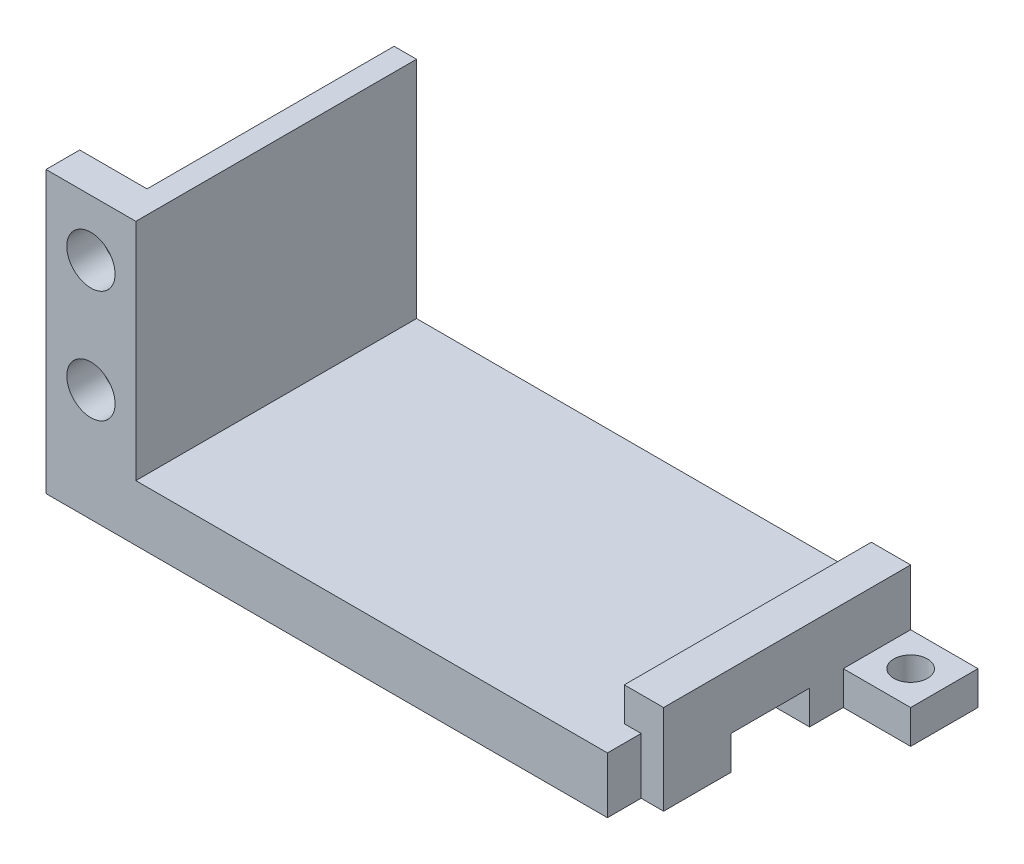
ISO-10303-21;
HEADER;
FILE_DESCRIPTION(('STEP AP214'),'2;1');
FILE_NAME('part.step','',(''),(''),'','','');
FILE_SCHEMA(('AUTOMOTIVE_DESIGN { 1 0 10303 214 1 1 1 1 }'));
ENDSEC;
DATA;
#1=APPLICATION_CONTEXT('core data for automotive mechanical design processes');
#2=APPLICATION_PROTOCOL_DEFINITION('international standard','automotive_design',2000,#1);
#3=PRODUCT_CONTEXT('',#1,'mechanical');
#4=PRODUCT('Part','Part','',(#3));
#5=PRODUCT_RELATED_PRODUCT_CATEGORY('part','',(#4));
#6=PRODUCT_DEFINITION_FORMATION('','',#4);
#7=PRODUCT_DEFINITION_CONTEXT('part definition',#1,'design');
#8=PRODUCT_DEFINITION('design','',#6,#7);
#9=PRODUCT_DEFINITION_SHAPE('','',#8);
#10=(LENGTH_UNIT() NAMED_UNIT(*) SI_UNIT(.MILLI.,.METRE.));
#11=(NAMED_UNIT(*) PLANE_ANGLE_UNIT() SI_UNIT($,.RADIAN.));
#12=(NAMED_UNIT(*) SI_UNIT($,.STERADIAN.) SOLID_ANGLE_UNIT());
#13=UNCERTAINTY_MEASURE_WITH_UNIT(LENGTH_MEASURE(1.E-05),#10,'distance_accuracy_value','');
#14=(GEOMETRIC_REPRESENTATION_CONTEXT(3) GLOBAL_UNCERTAINTY_ASSIGNED_CONTEXT((#13)) GLOBAL_UNIT_ASSIGNED_CONTEXT((#10,
#11,#12)) REPRESENTATION_CONTEXT('',''));
#15=CARTESIAN_POINT('',(0.,0.,0.));
#16=DIRECTION('',(0.,0.,1.));
#17=DIRECTION('',(1.,0.,0.));
#18=AXIS2_PLACEMENT_3D('',#15,#16,#17);
#19=CARTESIAN_POINT('',(0.,-15.,0.));
#20=DIRECTION('',(0.,-1.,0.));
#21=DIRECTION('',(0.,0.,-1.));
#22=AXIS2_PLACEMENT_3D('',#19,#20,#21);
#23=PLANE('',#22);
#24=DIRECTION('',(1.,0.,0.));
#25=VECTOR('',#24,1.);
#26=CARTESIAN_POINT('',(0.,-15.,-13.));
#27=LINE('',#26,#25);
#28=CARTESIAN_POINT('',(1.3,-15.,-13.));
#29=VERTEX_POINT('',#28);
#30=CARTESIAN_POINT('',(47.3,-15.,-13.));
#31=VERTEX_POINT('',#30);
#32=EDGE_CURVE('E11',#29,#31,#27,.T.);
#33=ORIENTED_EDGE('',*,*,#32,.F.);
#34=DIRECTION('',(0.,0.,-1.));
#35=VECTOR('',#34,1.);
#36=CARTESIAN_POINT('',(1.3,-15.,-22.));
#37=LINE('',#36,#35);
#38=CARTESIAN_POINT('',(1.3,-15.,-16.));
#39=VERTEX_POINT('',#38);
#40=EDGE_CURVE('E226',#29,#39,#37,.T.);
#41=ORIENTED_EDGE('',*,*,#40,.T.);
#42=DIRECTION('',(1.,0.,0.));
#43=VECTOR('',#42,1.);
#44=CARTESIAN_POINT('',(-4.7,-15.,-16.));
#45=LINE('',#44,#43);
#46=CARTESIAN_POINT('',(-4.7,-15.,-16.));
#47=VERTEX_POINT('',#46);
#48=EDGE_CURVE('E396',#47,#39,#45,.T.);
#49=ORIENTED_EDGE('',*,*,#48,.F.);
#50=DIRECTION('',(0.,0.,1.));
#51=VECTOR('',#50,1.);
#52=CARTESIAN_POINT('',(-4.7,-15.,-22.));
#53=LINE('',#52,#51);
#54=CARTESIAN_POINT('',(-4.7,-15.,-22.));
#55=VERTEX_POINT('',#54);
#56=EDGE_CURVE('E381',#55,#47,#53,.T.);
#57=ORIENTED_EDGE('',*,*,#56,.F.);
#58=DIRECTION('',(1.,0.,0.));
#59=VECTOR('',#58,1.);
#60=CARTESIAN_POINT('',(1.3,-15.,-22.));
#61=LINE('',#60,#59);
#62=CARTESIAN_POINT('',(53.3,-15.,-22.));
#63=VERTEX_POINT('',#62);
#64=EDGE_CURVE('E239',#55,#63,#61,.T.);
#65=ORIENTED_EDGE('',*,*,#64,.T.);
#66=DIRECTION('',(0.,0.,-1.));
#67=VECTOR('',#66,1.);
#68=CARTESIAN_POINT('',(53.3,-15.,-22.));
#69=LINE('',#68,#67);
#70=CARTESIAN_POINT('',(53.3,-15.,-16.));
#71=VERTEX_POINT('',#70);
#72=EDGE_CURVE('E358',#71,#63,#69,.T.);
#73=ORIENTED_EDGE('',*,*,#72,.F.);
#74=DIRECTION('',(-1.,0.,0.));
#75=VECTOR('',#74,1.);
#76=CARTESIAN_POINT('',(53.3,-15.,-16.));
#77=LINE('',#76,#75);
#78=CARTESIAN_POINT('',(47.3,-15.,-16.));
#79=VERTEX_POINT('',#78);
#80=EDGE_CURVE('E361',#71,#79,#77,.T.);
#81=ORIENTED_EDGE('',*,*,#80,.T.);
#82=DIRECTION('',(0.,0.,1.));
#83=VECTOR('',#82,1.);
#84=CARTESIAN_POINT('',(47.3,-15.,0.));
#85=LINE('',#84,#83);
#86=EDGE_CURVE('E230',#79,#31,#85,.T.);
#87=ORIENTED_EDGE('',*,*,#86,.T.);
#88=EDGE_LOOP('',(#33,#41,#49,#57,#65,#73,#81,#87));
#89=FACE_BOUND('',#88,.T.);
#90=CARTESIAN_POINT('',(50.3,-15.,-19.));
#91=DIRECTION('',(0.,-1.,0.));
#92=DIRECTION('',(0.,0.,-1.));
#93=AXIS2_PLACEMENT_3D('',#90,#91,#92);
#94=CIRCLE('',#93,1.5);
#95=CARTESIAN_POINT('',(50.3,-15.,-20.5));
#96=VERTEX_POINT('',#95);
#97=EDGE_CURVE('E346',#96,#96,#94,.T.);
#98=ORIENTED_EDGE('',*,*,#97,.F.);
#99=EDGE_LOOP('',(#98));
#100=FACE_BOUND('',#99,.T.);
#101=CARTESIAN_POINT('',(-1.7,-15.,-19.));
#102=DIRECTION('',(0.,-1.,0.));
#103=DIRECTION('',(0.,0.,-1.));
#104=AXIS2_PLACEMENT_3D('',#101,#102,#103);
#105=CIRCLE('',#104,1.5);
#106=CARTESIAN_POINT('',(-1.7,-15.,-20.5));
#107=VERTEX_POINT('',#106);
#108=EDGE_CURVE('E375',#107,#107,#105,.T.);
#109=ORIENTED_EDGE('',*,*,#108,.F.);
#110=EDGE_LOOP('',(#109));
#111=FACE_BOUND('',#110,.T.);
#112=ADVANCED_FACE('F38',(#89,#100,#111),#23,.T.);
#113=CARTESIAN_POINT('',(1.3,10.,-22.));
#114=DIRECTION('',(1.,0.,0.));
#115=DIRECTION('',(0.,0.,-1.));
#116=AXIS2_PLACEMENT_3D('',#113,#114,#115);
#117=PLANE('',#116);
#118=DIRECTION('',(0.,1.,0.));
#119=VECTOR('',#118,1.);
#120=CARTESIAN_POINT('',(1.3,10.,-22.));
#121=LINE('',#120,#119);
#122=CARTESIAN_POINT('',(1.3,-4.21101330809702,-22.));
#123=VERTEX_POINT('',#122);
#124=CARTESIAN_POINT('',(1.3,4.21101330809702,-22.));
#125=VERTEX_POINT('',#124);
#126=EDGE_CURVE('E263',#123,#125,#121,.T.);
#127=ORIENTED_EDGE('',*,*,#126,.F.);
#128=DIRECTION('',(0.,0.,1.));
#129=VECTOR('',#128,1.);
#130=CARTESIAN_POINT('',(1.3,-4.21101330809702,-36.962340393569));
#131=LINE('',#130,#129);
#132=CARTESIAN_POINT('',(1.3,-4.21101330809702,0.));
#133=VERTEX_POINT('',#132);
#134=EDGE_CURVE('E338',#123,#133,#131,.T.);
#135=ORIENTED_EDGE('',*,*,#134,.T.);
#136=DIRECTION('',(0.,1.,0.));
#137=VECTOR('',#136,1.);
#138=CARTESIAN_POINT('',(1.3,10.,0.));
#139=LINE('',#138,#137);
#140=CARTESIAN_POINT('',(1.3,4.21101330809702,0.));
#141=VERTEX_POINT('',#140);
#142=EDGE_CURVE('E271',#133,#141,#139,.T.);
#143=ORIENTED_EDGE('',*,*,#142,.T.);
#144=DIRECTION('',(0.,0.,1.));
#145=VECTOR('',#144,1.);
#146=CARTESIAN_POINT('',(1.3,4.21101330809702,-36.962340393569));
#147=LINE('',#146,#145);
#148=EDGE_CURVE('E326',#141,#125,#147,.F.);
#149=ORIENTED_EDGE('',*,*,#148,.T.);
#150=EDGE_LOOP('',(#127,#135,#143,#149));
#151=FACE_BOUND('',#150,.T.);
#152=ADVANCED_FACE('F488',(#151),#117,.F.);
#153=CARTESIAN_POINT('',(1.3,5.78898669190298,-22.));
#154=VERTEX_POINT('',#153);
#155=CARTESIAN_POINT('',(1.3,10.,-22.));
#156=VERTEX_POINT('',#155);
#157=EDGE_CURVE('E258',#154,#156,#121,.T.);
#158=ORIENTED_EDGE('',*,*,#157,.F.);
#159=DIRECTION('',(0.,0.,1.));
#160=VECTOR('',#159,1.);
#161=CARTESIAN_POINT('',(1.3,5.78898669190298,-36.962340393569));
#162=LINE('',#161,#160);
#163=CARTESIAN_POINT('',(1.3,5.78898669190298,0.));
#164=VERTEX_POINT('',#163);
#165=EDGE_CURVE('E61',#154,#164,#162,.T.);
#166=ORIENTED_EDGE('',*,*,#165,.T.);
#167=CARTESIAN_POINT('',(1.3,10.,0.));
#168=VERTEX_POINT('',#167);
#169=EDGE_CURVE('E272',#164,#168,#139,.T.);
#170=ORIENTED_EDGE('',*,*,#169,.T.);
#171=DIRECTION('',(0.,0.,1.));
#172=VECTOR('',#171,1.);
#173=CARTESIAN_POINT('',(1.3,10.,-22.));
#174=LINE('',#173,#172);
#175=EDGE_CURVE('E266',#156,#168,#174,.T.);
#176=ORIENTED_EDGE('',*,*,#175,.F.);
#177=EDGE_LOOP('',(#158,#166,#170,#176));
#178=FACE_BOUND('',#177,.T.);
#179=ADVANCED_FACE('F523',(#178),#117,.F.);
#180=CARTESIAN_POINT('',(47.3,-15.,0.));
#181=DIRECTION('',(-1.,0.,0.));
#182=DIRECTION('',(0.,0.,1.));
#183=AXIS2_PLACEMENT_3D('',#180,#181,#182);
#184=PLANE('',#183);
#185=DIRECTION('',(0.,0.,-1.));
#186=VECTOR('',#185,1.);
#187=CARTESIAN_POINT('',(47.3,-12.,0.));
#188=LINE('',#187,#186);
#189=CARTESIAN_POINT('',(47.3,-12.,-6.));
#190=VERTEX_POINT('',#189);
#191=CARTESIAN_POINT('',(47.3,-12.,-13.));
#192=VERTEX_POINT('',#191);
#193=EDGE_CURVE('E451',#190,#192,#188,.T.);
#194=ORIENTED_EDGE('',*,*,#193,.T.);
#195=DIRECTION('',(0.,-1.,0.));
#196=VECTOR('',#195,1.);
#197=CARTESIAN_POINT('',(47.3,-15.,-13.));
#198=LINE('',#197,#196);
#199=EDGE_CURVE('E454',#192,#31,#198,.T.);
#200=ORIENTED_EDGE('',*,*,#199,.T.);
#201=ORIENTED_EDGE('',*,*,#86,.F.);
#202=DIRECTION('',(0.,-1.,0.));
#203=VECTOR('',#202,1.);
#204=CARTESIAN_POINT('',(47.3,-15.,-16.));
#205=LINE('',#204,#203);
#206=CARTESIAN_POINT('',(47.3,-12.,-16.));
#207=VERTEX_POINT('',#206);
#208=EDGE_CURVE('E354',#207,#79,#205,.T.);
#209=ORIENTED_EDGE('',*,*,#208,.F.);
#210=DIRECTION('',(0.,0.,1.));
#211=VECTOR('',#210,1.);
#212=CARTESIAN_POINT('',(47.3,-12.,-22.));
#213=LINE('',#212,#211);
#214=CARTESIAN_POINT('',(47.3,-12.,-22.));
#215=VERTEX_POINT('',#214);
#216=EDGE_CURVE('E349',#215,#207,#213,.T.);
#217=ORIENTED_EDGE('',*,*,#216,.F.);
#218=DIRECTION('',(0.,1.,0.));
#219=VECTOR('',#218,1.);
#220=CARTESIAN_POINT('',(47.3,-15.,-22.));
#221=LINE('',#220,#219);
#222=CARTESIAN_POINT('',(47.3,-7.,-22.));
#223=VERTEX_POINT('',#222);
#224=EDGE_CURVE('E410',#215,#223,#221,.T.);
#225=ORIENTED_EDGE('',*,*,#224,.T.);
#226=DIRECTION('',(0.,0.,-1.));
#227=VECTOR('',#226,1.);
#228=CARTESIAN_POINT('',(47.3,-7.,-22.));
#229=LINE('',#228,#227);
#230=CARTESIAN_POINT('',(47.3,-7.,0.));
#231=VERTEX_POINT('',#230);
#232=EDGE_CURVE('E401',#231,#223,#229,.T.);
#233=ORIENTED_EDGE('',*,*,#232,.F.);
#234=DIRECTION('',(0.,1.,0.));
#235=VECTOR('',#234,1.);
#236=CARTESIAN_POINT('',(47.3,-15.,0.));
#237=LINE('',#236,#235);
#238=CARTESIAN_POINT('',(47.3,-15.,0.));
#239=VERTEX_POINT('',#238);
#240=EDGE_CURVE('E414',#239,#231,#237,.T.);
#241=ORIENTED_EDGE('',*,*,#240,.F.);
#242=CARTESIAN_POINT('',(47.3,-15.,-6.));
#243=VERTEX_POINT('',#242);
#244=EDGE_CURVE('E406',#243,#239,#85,.T.);
#245=ORIENTED_EDGE('',*,*,#244,.F.);
#246=DIRECTION('',(0.,1.,0.));
#247=VECTOR('',#246,1.);
#248=CARTESIAN_POINT('',(47.3,-15.,-6.));
#249=LINE('',#248,#247);
#250=EDGE_CURVE('E53',#243,#190,#249,.T.);
#251=ORIENTED_EDGE('',*,*,#250,.T.);
#252=EDGE_LOOP('',(#194,#200,#201,#209,#217,#225,#233,#241,#245,#251));
#253=FACE_BOUND('',#252,.T.);
#254=ADVANCED_FACE('F463',(#253),#184,.F.);
#255=ORIENTED_EDGE('',*,*,#40,.F.);
#256=DIRECTION('',(0.,-1.,0.));
#257=VECTOR('',#256,1.);
#258=CARTESIAN_POINT('',(1.3,-15.,-13.));
#259=LINE('',#258,#257);
#260=CARTESIAN_POINT('',(1.3,-12.,-13.));
#261=VERTEX_POINT('',#260);
#262=EDGE_CURVE('E210',#261,#29,#259,.T.);
#263=ORIENTED_EDGE('',*,*,#262,.F.);
#264=DIRECTION('',(0.,0.,-1.));
#265=VECTOR('',#264,1.);
#266=CARTESIAN_POINT('',(1.3,-12.,-13.));
#267=LINE('',#266,#265);
#268=CARTESIAN_POINT('',(1.3,-12.,-6.));
#269=VERTEX_POINT('',#268);
#270=EDGE_CURVE('E295',#269,#261,#267,.T.);
#271=ORIENTED_EDGE('',*,*,#270,.F.);
#272=DIRECTION('',(0.,1.,0.));
#273=VECTOR('',#272,1.);
#274=CARTESIAN_POINT('',(1.3,-15.,-6.));
#275=LINE('',#274,#273);
#276=CARTESIAN_POINT('',(1.3,-15.,-6.));
#277=VERTEX_POINT('',#276);
#278=EDGE_CURVE('E220',#277,#269,#275,.T.);
#279=ORIENTED_EDGE('',*,*,#278,.F.);
#280=CARTESIAN_POINT('',(1.3,-15.,0.));
#281=VERTEX_POINT('',#280);
#282=EDGE_CURVE('E235',#281,#277,#37,.T.);
#283=ORIENTED_EDGE('',*,*,#282,.F.);
#284=CARTESIAN_POINT('',(1.3,-5.78898669190298,0.));
#285=VERTEX_POINT('',#284);
#286=EDGE_CURVE('E267',#281,#285,#139,.T.);
#287=ORIENTED_EDGE('',*,*,#286,.T.);
#288=DIRECTION('',(0.,0.,1.));
#289=VECTOR('',#288,1.);
#290=CARTESIAN_POINT('',(1.3,-5.78898669190298,-36.962340393569));
#291=LINE('',#290,#289);
#292=CARTESIAN_POINT('',(1.3,-5.78898669190298,-22.));
#293=VERTEX_POINT('',#292);
#294=EDGE_CURVE('E335',#285,#293,#291,.F.);
#295=ORIENTED_EDGE('',*,*,#294,.T.);
#296=CARTESIAN_POINT('',(1.3,-12.,-22.));
#297=VERTEX_POINT('',#296);
#298=EDGE_CURVE('E259',#297,#293,#121,.T.);
#299=ORIENTED_EDGE('',*,*,#298,.F.);
#300=DIRECTION('',(0.,0.,-1.));
#301=VECTOR('',#300,1.);
#302=CARTESIAN_POINT('',(1.3,-12.,-22.));
#303=LINE('',#302,#301);
#304=CARTESIAN_POINT('',(1.3,-12.,-16.));
#305=VERTEX_POINT('',#304);
#306=EDGE_CURVE('E382',#305,#297,#303,.T.);
#307=ORIENTED_EDGE('',*,*,#306,.F.);
#308=DIRECTION('',(0.,1.,0.));
#309=VECTOR('',#308,1.);
#310=CARTESIAN_POINT('',(1.3,-15.,-16.));
#311=LINE('',#310,#309);
#312=EDGE_CURVE('E234',#39,#305,#311,.T.);
#313=ORIENTED_EDGE('',*,*,#312,.F.);
#314=EDGE_LOOP('',(#255,#263,#271,#279,#283,#287,#295,#299,#307,#313));
#315=FACE_BOUND('',#314,.T.);
#316=ADVANCED_FACE('F232',(#315),#117,.F.);
#317=CARTESIAN_POINT('',(0.,0.,0.));
#318=DIRECTION('',(0.,0.,1.));
#319=DIRECTION('',(1.,0.,0.));
#320=AXIS2_PLACEMENT_3D('',#317,#318,#319);
#321=PLANE('',#320);
#322=ORIENTED_EDGE('',*,*,#142,.F.);
#323=CARTESIAN_POINT('',(-0.699999999999999,-5.,0.));
#324=DIRECTION('',(0.,0.,1.));
#325=DIRECTION('',(1.,0.,0.));
#326=AXIS2_PLACEMENT_3D('',#323,#324,#325);
#327=CIRCLE('',#326,2.15);
#328=EDGE_CURVE('E341',#133,#285,#327,.T.);
#329=ORIENTED_EDGE('',*,*,#328,.T.);
#330=ORIENTED_EDGE('',*,*,#286,.F.);
#331=DIRECTION('',(1.,0.,0.));
#332=VECTOR('',#331,1.);
#333=CARTESIAN_POINT('',(-3.3,-15.,0.));
#334=LINE('',#333,#332);
#335=CARTESIAN_POINT('',(-4.7,-15.,0.));
#336=VERTEX_POINT('',#335);
#337=EDGE_CURVE('E248',#336,#281,#334,.T.);
#338=ORIENTED_EDGE('',*,*,#337,.F.);
#339=DIRECTION('',(0.,-1.,0.));
#340=VECTOR('',#339,1.);
#341=CARTESIAN_POINT('',(-4.7,10.,0.));
#342=LINE('',#341,#340);
#343=CARTESIAN_POINT('',(-4.7,10.,0.));
#344=VERTEX_POINT('',#343);
#345=EDGE_CURVE('E307',#344,#336,#342,.T.);
#346=ORIENTED_EDGE('',*,*,#345,.F.);
#347=DIRECTION('',(-1.,0.,0.));
#348=VECTOR('',#347,1.);
#349=CARTESIAN_POINT('',(-3.3,10.,0.));
#350=LINE('',#349,#348);
#351=EDGE_CURVE('E275',#168,#344,#350,.T.);
#352=ORIENTED_EDGE('',*,*,#351,.F.);
#353=ORIENTED_EDGE('',*,*,#169,.F.);
#354=CARTESIAN_POINT('',(-0.699999999999999,5.,0.));
#355=DIRECTION('',(0.,0.,1.));
#356=DIRECTION('',(1.,0.,0.));
#357=AXIS2_PLACEMENT_3D('',#354,#355,#356);
#358=CIRCLE('',#357,2.15);
#359=EDGE_CURVE('E332',#164,#141,#358,.T.);
#360=ORIENTED_EDGE('',*,*,#359,.T.);
#361=EDGE_LOOP('',(#322,#329,#330,#338,#346,#352,#353,#360));
#362=FACE_BOUND('',#361,.T.);
#363=ADVANCED_FACE('F305',(#362),#321,.F.);
#364=CARTESIAN_POINT('',(3.3,10.,3.));
#365=DIRECTION('',(-1.,0.,0.));
#366=DIRECTION('',(0.,-1.,0.));
#367=AXIS2_PLACEMENT_3D('',#364,#365,#366);
#368=PLANE('',#367);
#369=DIRECTION('',(0.,-1.,0.));
#370=VECTOR('',#369,1.);
#371=CARTESIAN_POINT('',(3.3,10.,-22.));
#372=LINE('',#371,#370);
#373=CARTESIAN_POINT('',(3.3,10.,-22.));
#374=VERTEX_POINT('',#373);
#375=CARTESIAN_POINT('',(3.3,-10.,-22.));
#376=VERTEX_POINT('',#375);
#377=EDGE_CURVE('E255',#374,#376,#372,.T.);
#378=ORIENTED_EDGE('',*,*,#377,.F.);
#379=DIRECTION('',(0.,0.,-1.));
#380=VECTOR('',#379,1.);
#381=CARTESIAN_POINT('',(3.3,10.,3.));
#382=LINE('',#381,#380);
#383=CARTESIAN_POINT('',(3.3,10.,3.));
#384=VERTEX_POINT('',#383);
#385=EDGE_CURVE('E283',#384,#374,#382,.T.);
#386=ORIENTED_EDGE('',*,*,#385,.F.);
#387=DIRECTION('',(0.,1.,0.));
#388=VECTOR('',#387,1.);
#389=CARTESIAN_POINT('',(3.3,10.,3.));
#390=LINE('',#389,#388);
#391=CARTESIAN_POINT('',(3.3,-10.,3.));
#392=VERTEX_POINT('',#391);
#393=EDGE_CURVE('E276',#392,#384,#390,.T.);
#394=ORIENTED_EDGE('',*,*,#393,.F.);
#395=DIRECTION('',(0.,0.,-1.));
#396=VECTOR('',#395,1.);
#397=CARTESIAN_POINT('',(3.3,-10.,3.));
#398=LINE('',#397,#396);
#399=EDGE_CURVE('E280',#392,#376,#398,.T.);
#400=ORIENTED_EDGE('',*,*,#399,.T.);
#401=EDGE_LOOP('',(#378,#386,#394,#400));
#402=FACE_BOUND('',#401,.T.);
#403=ADVANCED_FACE('F40',(#402),#368,.F.);
#404=CARTESIAN_POINT('',(-3.3,10.,3.));
#405=DIRECTION('',(0.,-1.,0.));
#406=DIRECTION('',(0.,0.,-1.));
#407=AXIS2_PLACEMENT_3D('',#404,#405,#406);
#408=PLANE('',#407);
#409=ORIENTED_EDGE('',*,*,#175,.T.);
#410=ORIENTED_EDGE('',*,*,#351,.T.);
#411=DIRECTION('',(0.,0.,-1.));
#412=VECTOR('',#411,1.);
#413=CARTESIAN_POINT('',(-4.7,10.,3.));
#414=LINE('',#413,#412);
#415=CARTESIAN_POINT('',(-4.7,10.,3.));
#416=VERTEX_POINT('',#415);
#417=EDGE_CURVE('E315',#416,#344,#414,.T.);
#418=ORIENTED_EDGE('',*,*,#417,.F.);
#419=DIRECTION('',(-1.,0.,0.));
#420=VECTOR('',#419,1.);
#421=CARTESIAN_POINT('',(-3.3,10.,3.));
#422=LINE('',#421,#420);
#423=EDGE_CURVE('E278',#384,#416,#422,.T.);
#424=ORIENTED_EDGE('',*,*,#423,.F.);
#425=ORIENTED_EDGE('',*,*,#385,.T.);
#426=DIRECTION('',(1.,0.,0.));
#427=VECTOR('',#426,1.);
#428=CARTESIAN_POINT('',(3.3,10.,-22.));
#429=LINE('',#428,#427);
#430=EDGE_CURVE('E262',#156,#374,#429,.T.);
#431=ORIENTED_EDGE('',*,*,#430,.F.);
#432=EDGE_LOOP('',(#409,#410,#418,#424,#425,#431));
#433=FACE_BOUND('',#432,.T.);
#434=ADVANCED_FACE('F481',(#433),#408,.F.);
#435=CARTESIAN_POINT('',(0.,0.,3.));
#436=DIRECTION('',(0.,0.,1.));
#437=DIRECTION('',(1.,0.,0.));
#438=AXIS2_PLACEMENT_3D('',#435,#436,#437);
#439=PLANE('',#438);
#440=CARTESIAN_POINT('',(-0.699999999999999,-5.,3.));
#441=DIRECTION('',(0.,0.,1.));
#442=DIRECTION('',(1.,0.,0.));
#443=AXIS2_PLACEMENT_3D('',#440,#441,#442);
#444=CIRCLE('',#443,2.15);
#445=CARTESIAN_POINT('',(1.45,-5.,3.));
#446=VERTEX_POINT('',#445);
#447=EDGE_CURVE('E323',#446,#446,#444,.T.);
#448=ORIENTED_EDGE('',*,*,#447,.F.);
#449=EDGE_LOOP('',(#448));
#450=FACE_BOUND('',#449,.T.);
#451=CARTESIAN_POINT('',(-0.699999999999999,5.,3.));
#452=DIRECTION('',(0.,0.,1.));
#453=DIRECTION('',(1.,0.,0.));
#454=AXIS2_PLACEMENT_3D('',#451,#452,#453);
#455=CIRCLE('',#454,2.15);
#456=CARTESIAN_POINT('',(1.45,5.,3.));
#457=VERTEX_POINT('',#456);
#458=EDGE_CURVE('E317',#457,#457,#455,.T.);
#459=ORIENTED_EDGE('',*,*,#458,.F.);
#460=EDGE_LOOP('',(#459));
#461=FACE_BOUND('',#460,.T.);
#462=DIRECTION('',(-1.,0.,0.));
#463=VECTOR('',#462,1.);
#464=CARTESIAN_POINT('',(1.3,-10.,3.));
#465=LINE('',#464,#463);
#466=CARTESIAN_POINT('',(45.3,-10.,3.00000000000001));
#467=VERTEX_POINT('',#466);
#468=EDGE_CURVE('E236',#467,#392,#465,.T.);
#469=ORIENTED_EDGE('',*,*,#468,.T.);
#470=ORIENTED_EDGE('',*,*,#393,.T.);
#471=ORIENTED_EDGE('',*,*,#423,.T.);
#472=DIRECTION('',(0.,1.,0.));
#473=VECTOR('',#472,1.);
#474=CARTESIAN_POINT('',(-4.7,10.,3.));
#475=LINE('',#474,#473);
#476=CARTESIAN_POINT('',(-4.7,-15.,3.));
#477=VERTEX_POINT('',#476);
#478=EDGE_CURVE('E319',#477,#416,#475,.T.);
#479=ORIENTED_EDGE('',*,*,#478,.F.);
#480=DIRECTION('',(-1.,0.,0.));
#481=VECTOR('',#480,1.);
#482=CARTESIAN_POINT('',(-3.3,-15.,3.));
#483=LINE('',#482,#481);
#484=CARTESIAN_POINT('',(45.3,-15.,3.00000000000001));
#485=VERTEX_POINT('',#484);
#486=EDGE_CURVE('E253',#485,#477,#483,.T.);
#487=ORIENTED_EDGE('',*,*,#486,.F.);
#488=DIRECTION('',(0.,1.,0.));
#489=VECTOR('',#488,1.);
#490=CARTESIAN_POINT('',(45.3,-15.,3.00000000000001));
#491=LINE('',#490,#489);
#492=EDGE_CURVE('E245',#485,#467,#491,.T.);
#493=ORIENTED_EDGE('',*,*,#492,.T.);
#494=EDGE_LOOP('',(#469,#470,#471,#479,#487,#493));
#495=FACE_BOUND('',#494,.T.);
#496=ADVANCED_FACE('F431',(#450,#461,#495),#439,.T.);
#497=CARTESIAN_POINT('',(0.,0.,-22.));
#498=DIRECTION('',(0.,0.,-1.));
#499=DIRECTION('',(-1.,0.,0.));
#500=AXIS2_PLACEMENT_3D('',#497,#498,#499);
#501=PLANE('',#500);
#502=DIRECTION('',(1.,0.,0.));
#503=VECTOR('',#502,1.);
#504=CARTESIAN_POINT('',(1.3,-10.,-22.));
#505=LINE('',#504,#503);
#506=CARTESIAN_POINT('',(43.8,-10.,-22.));
#507=VERTEX_POINT('',#506);
#508=EDGE_CURVE('E241',#376,#507,#505,.T.);
#509=ORIENTED_EDGE('',*,*,#508,.T.);
#510=DIRECTION('',(0.,1.,0.));
#511=VECTOR('',#510,1.);
#512=CARTESIAN_POINT('',(43.8,-14.4,-22.));
#513=LINE('',#512,#511);
#514=CARTESIAN_POINT('',(43.8,-7.,-22.));
#515=VERTEX_POINT('',#514);
#516=EDGE_CURVE('E443',#507,#515,#513,.T.);
#517=ORIENTED_EDGE('',*,*,#516,.T.);
#518=DIRECTION('',(-1.,0.,0.));
#519=VECTOR('',#518,1.);
#520=CARTESIAN_POINT('',(45.3,-7.,-22.));
#521=LINE('',#520,#519);
#522=EDGE_CURVE('E404',#223,#515,#521,.T.);
#523=ORIENTED_EDGE('',*,*,#522,.F.);
#524=ORIENTED_EDGE('',*,*,#224,.F.);
#525=DIRECTION('',(-1.,0.,0.));
#526=VECTOR('',#525,1.);
#527=CARTESIAN_POINT('',(53.3,-12.,-22.));
#528=LINE('',#527,#526);
#529=CARTESIAN_POINT('',(53.3,-12.,-22.));
#530=VERTEX_POINT('',#529);
#531=EDGE_CURVE('E369',#530,#215,#528,.T.);
#532=ORIENTED_EDGE('',*,*,#531,.F.);
#533=DIRECTION('',(0.,1.,0.));
#534=VECTOR('',#533,1.);
#535=CARTESIAN_POINT('',(53.3,-15.,-22.));
#536=LINE('',#535,#534);
#537=EDGE_CURVE('E350',#63,#530,#536,.T.);
#538=ORIENTED_EDGE('',*,*,#537,.F.);
#539=ORIENTED_EDGE('',*,*,#64,.F.);
#540=DIRECTION('',(0.,-1.,0.));
#541=VECTOR('',#540,1.);
#542=CARTESIAN_POINT('',(-4.7,-15.,-22.));
#543=LINE('',#542,#541);
#544=CARTESIAN_POINT('',(-4.7,-12.,-22.));
#545=VERTEX_POINT('',#544);
#546=EDGE_CURVE('E378',#545,#55,#543,.T.);
#547=ORIENTED_EDGE('',*,*,#546,.F.);
#548=DIRECTION('',(1.,0.,0.));
#549=VECTOR('',#548,1.);
#550=CARTESIAN_POINT('',(-4.7,-12.,-22.));
#551=LINE('',#550,#549);
#552=EDGE_CURVE('E388',#545,#297,#551,.T.);
#553=ORIENTED_EDGE('',*,*,#552,.T.);
#554=ORIENTED_EDGE('',*,*,#298,.T.);
#555=CARTESIAN_POINT('',(-0.699999999999999,-5.,-22.));
#556=DIRECTION('',(0.,0.,-1.));
#557=DIRECTION('',(-1.,0.,0.));
#558=AXIS2_PLACEMENT_3D('',#555,#556,#557);
#559=CIRCLE('',#558,2.15);
#560=EDGE_CURVE('E286',#123,#293,#559,.T.);
#561=ORIENTED_EDGE('',*,*,#560,.F.);
#562=ORIENTED_EDGE('',*,*,#126,.T.);
#563=CARTESIAN_POINT('',(-0.699999999999999,5.,-22.));
#564=DIRECTION('',(0.,0.,-1.));
#565=DIRECTION('',(-1.,0.,0.));
#566=AXIS2_PLACEMENT_3D('',#563,#564,#565);
#567=CIRCLE('',#566,2.15);
#568=EDGE_CURVE('E270',#154,#125,#567,.T.);
#569=ORIENTED_EDGE('',*,*,#568,.F.);
#570=ORIENTED_EDGE('',*,*,#157,.T.);
#571=ORIENTED_EDGE('',*,*,#430,.T.);
#572=ORIENTED_EDGE('',*,*,#377,.T.);
#573=EDGE_LOOP('',(#509,#517,#523,#524,#532,#538,#539,#547,#553,#554,#561,#562,#569,#570,#571,#572));
#574=FACE_BOUND('',#573,.T.);
#575=ADVANCED_FACE('F474',(#574),#501,.T.);
#576=DIRECTION('',(-1.,0.,0.));
#577=VECTOR('',#576,1.);
#578=CARTESIAN_POINT('',(0.,-15.,-6.));
#579=LINE('',#578,#577);
#580=EDGE_CURVE('E46',#243,#277,#579,.T.);
#581=ORIENTED_EDGE('',*,*,#580,.F.);
#582=ORIENTED_EDGE('',*,*,#244,.T.);
#583=DIRECTION('',(-1.,0.,0.));
#584=VECTOR('',#583,1.);
#585=CARTESIAN_POINT('',(47.3,-15.,0.));
#586=LINE('',#585,#584);
#587=CARTESIAN_POINT('',(45.3,-15.,0.));
#588=VERTEX_POINT('',#587);
#589=EDGE_CURVE('E408',#239,#588,#586,.T.);
#590=ORIENTED_EDGE('',*,*,#589,.T.);
#591=DIRECTION('',(0.,0.,1.));
#592=VECTOR('',#591,1.);
#593=CARTESIAN_POINT('',(45.3,-15.,-22.));
#594=LINE('',#593,#592);
#595=EDGE_CURVE('E417',#588,#485,#594,.T.);
#596=ORIENTED_EDGE('',*,*,#595,.T.);
#597=ORIENTED_EDGE('',*,*,#486,.T.);
#598=DIRECTION('',(0.,0.,1.));
#599=VECTOR('',#598,1.);
#600=CARTESIAN_POINT('',(-4.7,-15.,3.));
#601=LINE('',#600,#599);
#602=EDGE_CURVE('E300',#336,#477,#601,.T.);
#603=ORIENTED_EDGE('',*,*,#602,.F.);
#604=ORIENTED_EDGE('',*,*,#337,.T.);
#605=ORIENTED_EDGE('',*,*,#282,.T.);
#606=EDGE_LOOP('',(#581,#582,#590,#596,#597,#603,#604,#605));
#607=FACE_BOUND('',#606,.T.);
#608=ADVANCED_FACE('F297',(#607),#23,.T.);
#609=CARTESIAN_POINT('',(0.,-10.,0.));
#610=DIRECTION('',(0.,1.,0.));
#611=DIRECTION('',(0.,0.,1.));
#612=AXIS2_PLACEMENT_3D('',#609,#610,#611);
#613=PLANE('',#612);
#614=DIRECTION('',(1.,0.,0.));
#615=VECTOR('',#614,1.);
#616=CARTESIAN_POINT('',(0.,-10.,0.));
#617=LINE('',#616,#615);
#618=CARTESIAN_POINT('',(43.8,-10.,0.));
#619=VERTEX_POINT('',#618);
#620=CARTESIAN_POINT('',(45.3,-10.,0.));
#621=VERTEX_POINT('',#620);
#622=EDGE_CURVE('E438',#619,#621,#617,.T.);
#623=ORIENTED_EDGE('',*,*,#622,.F.);
#624=DIRECTION('',(0.,0.,1.));
#625=VECTOR('',#624,1.);
#626=CARTESIAN_POINT('',(43.8,-10.,0.));
#627=LINE('',#626,#625);
#628=EDGE_CURVE('E288',#507,#619,#627,.T.);
#629=ORIENTED_EDGE('',*,*,#628,.F.);
#630=ORIENTED_EDGE('',*,*,#508,.F.);
#631=ORIENTED_EDGE('',*,*,#399,.F.);
#632=ORIENTED_EDGE('',*,*,#468,.F.);
#633=DIRECTION('',(0.,0.,1.));
#634=VECTOR('',#633,1.);
#635=CARTESIAN_POINT('',(45.3,-10.,-22.));
#636=LINE('',#635,#634);
#637=EDGE_CURVE('E416',#621,#467,#636,.T.);
#638=ORIENTED_EDGE('',*,*,#637,.F.);
#639=EDGE_LOOP('',(#623,#629,#630,#631,#632,#638));
#640=FACE_BOUND('',#639,.T.);
#641=ADVANCED_FACE('F472',(#640),#613,.T.);
#642=CARTESIAN_POINT('',(45.3,-15.,-22.));
#643=DIRECTION('',(-1.,0.,0.));
#644=DIRECTION('',(0.,0.,1.));
#645=AXIS2_PLACEMENT_3D('',#642,#643,#644);
#646=PLANE('',#645);
#647=ORIENTED_EDGE('',*,*,#595,.F.);
#648=DIRECTION('',(0.,1.,0.));
#649=VECTOR('',#648,1.);
#650=CARTESIAN_POINT('',(45.3,-15.,0.));
#651=LINE('',#650,#649);
#652=EDGE_CURVE('E412',#588,#621,#651,.T.);
#653=ORIENTED_EDGE('',*,*,#652,.T.);
#654=ORIENTED_EDGE('',*,*,#637,.T.);
#655=ORIENTED_EDGE('',*,*,#492,.F.);
#656=EDGE_LOOP('',(#647,#653,#654,#655));
#657=FACE_BOUND('',#656,.T.);
#658=ADVANCED_FACE('F425',(#657),#646,.F.);
#659=CARTESIAN_POINT('',(47.3,-15.,0.));
#660=DIRECTION('',(0.,0.,-1.));
#661=DIRECTION('',(-1.,0.,0.));
#662=AXIS2_PLACEMENT_3D('',#659,#660,#661);
#663=PLANE('',#662);
#664=ORIENTED_EDGE('',*,*,#240,.T.);
#665=DIRECTION('',(1.,0.,0.));
#666=VECTOR('',#665,1.);
#667=CARTESIAN_POINT('',(45.3,-7.,0.));
#668=LINE('',#667,#666);
#669=CARTESIAN_POINT('',(43.8,-7.,0.));
#670=VERTEX_POINT('',#669);
#671=EDGE_CURVE('E398',#670,#231,#668,.T.);
#672=ORIENTED_EDGE('',*,*,#671,.F.);
#673=DIRECTION('',(0.,1.,0.));
#674=VECTOR('',#673,1.);
#675=CARTESIAN_POINT('',(43.8,-14.4,0.));
#676=LINE('',#675,#674);
#677=EDGE_CURVE('E440',#619,#670,#676,.T.);
#678=ORIENTED_EDGE('',*,*,#677,.F.);
#679=ORIENTED_EDGE('',*,*,#622,.T.);
#680=ORIENTED_EDGE('',*,*,#652,.F.);
#681=ORIENTED_EDGE('',*,*,#589,.F.);
#682=EDGE_LOOP('',(#664,#672,#678,#679,#680,#681));
#683=FACE_BOUND('',#682,.T.);
#684=ADVANCED_FACE('F436',(#683),#663,.F.);
#685=CARTESIAN_POINT('',(0.,-7.,0.));
#686=DIRECTION('',(0.,1.,0.));
#687=DIRECTION('',(0.,0.,1.));
#688=AXIS2_PLACEMENT_3D('',#685,#686,#687);
#689=PLANE('',#688);
#690=ORIENTED_EDGE('',*,*,#522,.T.);
#691=DIRECTION('',(0.,0.,1.));
#692=VECTOR('',#691,1.);
#693=CARTESIAN_POINT('',(43.8,-7.,-22.));
#694=LINE('',#693,#692);
#695=EDGE_CURVE('E447',#515,#670,#694,.T.);
#696=ORIENTED_EDGE('',*,*,#695,.T.);
#697=ORIENTED_EDGE('',*,*,#671,.T.);
#698=ORIENTED_EDGE('',*,*,#232,.T.);
#699=EDGE_LOOP('',(#690,#696,#697,#698));
#700=FACE_BOUND('',#699,.T.);
#701=ADVANCED_FACE('F466',(#700),#689,.T.);
#702=CARTESIAN_POINT('',(-4.7,-15.,-16.));
#703=DIRECTION('',(0.,0.,-1.));
#704=DIRECTION('',(-1.,0.,0.));
#705=AXIS2_PLACEMENT_3D('',#702,#703,#704);
#706=PLANE('',#705);
#707=ORIENTED_EDGE('',*,*,#312,.T.);
#708=DIRECTION('',(1.,0.,0.));
#709=VECTOR('',#708,1.);
#710=CARTESIAN_POINT('',(-4.7,-12.,-16.));
#711=LINE('',#710,#709);
#712=CARTESIAN_POINT('',(-4.7,-12.,-16.));
#713=VERTEX_POINT('',#712);
#714=EDGE_CURVE('E393',#713,#305,#711,.T.);
#715=ORIENTED_EDGE('',*,*,#714,.F.);
#716=DIRECTION('',(0.,1.,0.));
#717=VECTOR('',#716,1.);
#718=CARTESIAN_POINT('',(-4.7,-15.,-16.));
#719=LINE('',#718,#717);
#720=EDGE_CURVE('E384',#47,#713,#719,.T.);
#721=ORIENTED_EDGE('',*,*,#720,.F.);
#722=ORIENTED_EDGE('',*,*,#48,.T.);
#723=EDGE_LOOP('',(#707,#715,#721,#722));
#724=FACE_BOUND('',#723,.T.);
#725=ADVANCED_FACE('F501',(#724),#706,.F.);
#726=CARTESIAN_POINT('',(-4.7,-12.,-22.));
#727=DIRECTION('',(0.,-1.,0.));
#728=DIRECTION('',(0.,0.,-1.));
#729=AXIS2_PLACEMENT_3D('',#726,#727,#728);
#730=PLANE('',#729);
#731=CARTESIAN_POINT('',(-1.7,-12.,-19.));
#732=DIRECTION('',(0.,1.,0.));
#733=DIRECTION('',(0.,0.,1.));
#734=AXIS2_PLACEMENT_3D('',#731,#732,#733);
#735=CIRCLE('',#734,1.5);
#736=CARTESIAN_POINT('',(-1.7,-12.,-17.5));
#737=VERTEX_POINT('',#736);
#738=EDGE_CURVE('E372',#737,#737,#735,.T.);
#739=ORIENTED_EDGE('',*,*,#738,.F.);
#740=EDGE_LOOP('',(#739));
#741=FACE_BOUND('',#740,.T.);
#742=ORIENTED_EDGE('',*,*,#306,.T.);
#743=ORIENTED_EDGE('',*,*,#552,.F.);
#744=DIRECTION('',(0.,0.,-1.));
#745=VECTOR('',#744,1.);
#746=CARTESIAN_POINT('',(-4.7,-12.,-22.));
#747=LINE('',#746,#745);
#748=EDGE_CURVE('E386',#713,#545,#747,.T.);
#749=ORIENTED_EDGE('',*,*,#748,.F.);
#750=ORIENTED_EDGE('',*,*,#714,.T.);
#751=EDGE_LOOP('',(#742,#743,#749,#750));
#752=FACE_BOUND('',#751,.T.);
#753=ADVANCED_FACE('F497',(#741,#752),#730,.F.);
#754=CARTESIAN_POINT('',(-4.7,0.,0.));
#755=DIRECTION('',(1.,0.,0.));
#756=DIRECTION('',(0.,0.,-1.));
#757=AXIS2_PLACEMENT_3D('',#754,#755,#756);
#758=PLANE('',#757);
#759=ORIENTED_EDGE('',*,*,#546,.T.);
#760=ORIENTED_EDGE('',*,*,#56,.T.);
#761=ORIENTED_EDGE('',*,*,#720,.T.);
#762=ORIENTED_EDGE('',*,*,#748,.T.);
#763=EDGE_LOOP('',(#759,#760,#761,#762));
#764=FACE_BOUND('',#763,.T.);
#765=ADVANCED_FACE('F505',(#764),#758,.F.);
#766=CARTESIAN_POINT('',(-1.7,-18.,-19.));
#767=DIRECTION('',(0.,1.,0.));
#768=DIRECTION('',(0.,0.,1.));
#769=AXIS2_PLACEMENT_3D('',#766,#767,#768);
#770=CYLINDRICAL_SURFACE('',#769,1.5);
#771=ORIENTED_EDGE('',*,*,#108,.T.);
#772=EDGE_LOOP('',(#771));
#773=FACE_BOUND('',#772,.T.);
#774=ORIENTED_EDGE('',*,*,#738,.T.);
#775=EDGE_LOOP('',(#774));
#776=FACE_BOUND('',#775,.T.);
#777=ADVANCED_FACE('F507',(#773,#776),#770,.F.);
#778=CARTESIAN_POINT('',(53.3,-12.,-22.));
#779=DIRECTION('',(0.,-1.,0.));
#780=DIRECTION('',(0.,0.,-1.));
#781=AXIS2_PLACEMENT_3D('',#778,#779,#780);
#782=PLANE('',#781);
#783=CARTESIAN_POINT('',(50.3,-12.,-19.));
#784=DIRECTION('',(0.,1.,0.));
#785=DIRECTION('',(0.,0.,1.));
#786=AXIS2_PLACEMENT_3D('',#783,#784,#785);
#787=CIRCLE('',#786,1.5);
#788=CARTESIAN_POINT('',(50.3,-12.,-17.5));
#789=VERTEX_POINT('',#788);
#790=EDGE_CURVE('E343',#789,#789,#787,.T.);
#791=ORIENTED_EDGE('',*,*,#790,.F.);
#792=EDGE_LOOP('',(#791));
#793=FACE_BOUND('',#792,.T.);
#794=ORIENTED_EDGE('',*,*,#216,.T.);
#795=DIRECTION('',(-1.,0.,0.));
#796=VECTOR('',#795,1.);
#797=CARTESIAN_POINT('',(53.3,-12.,-16.));
#798=LINE('',#797,#796);
#799=CARTESIAN_POINT('',(53.3,-12.,-16.));
#800=VERTEX_POINT('',#799);
#801=EDGE_CURVE('E366',#800,#207,#798,.T.);
#802=ORIENTED_EDGE('',*,*,#801,.F.);
#803=DIRECTION('',(0.,0.,1.));
#804=VECTOR('',#803,1.);
#805=CARTESIAN_POINT('',(53.3,-12.,-22.));
#806=LINE('',#805,#804);
#807=EDGE_CURVE('E353',#530,#800,#806,.T.);
#808=ORIENTED_EDGE('',*,*,#807,.F.);
#809=ORIENTED_EDGE('',*,*,#531,.T.);
#810=EDGE_LOOP('',(#794,#802,#808,#809));
#811=FACE_BOUND('',#810,.T.);
#812=ADVANCED_FACE('F513',(#793,#811),#782,.F.);
#813=CARTESIAN_POINT('',(53.3,-15.,-16.));
#814=DIRECTION('',(0.,0.,-1.));
#815=DIRECTION('',(-1.,0.,0.));
#816=AXIS2_PLACEMENT_3D('',#813,#814,#815);
#817=PLANE('',#816);
#818=ORIENTED_EDGE('',*,*,#208,.T.);
#819=ORIENTED_EDGE('',*,*,#80,.F.);
#820=DIRECTION('',(0.,-1.,0.));
#821=VECTOR('',#820,1.);
#822=CARTESIAN_POINT('',(53.3,-15.,-16.));
#823=LINE('',#822,#821);
#824=EDGE_CURVE('E356',#800,#71,#823,.T.);
#825=ORIENTED_EDGE('',*,*,#824,.F.);
#826=ORIENTED_EDGE('',*,*,#801,.T.);
#827=EDGE_LOOP('',(#818,#819,#825,#826));
#828=FACE_BOUND('',#827,.T.);
#829=ADVANCED_FACE('F741',(#828),#817,.F.);
#830=CARTESIAN_POINT('',(53.3,0.,0.));
#831=DIRECTION('',(1.,0.,0.));
#832=DIRECTION('',(0.,0.,-1.));
#833=AXIS2_PLACEMENT_3D('',#830,#831,#832);
#834=PLANE('',#833);
#835=ORIENTED_EDGE('',*,*,#537,.T.);
#836=ORIENTED_EDGE('',*,*,#807,.T.);
#837=ORIENTED_EDGE('',*,*,#824,.T.);
#838=ORIENTED_EDGE('',*,*,#72,.T.);
#839=EDGE_LOOP('',(#835,#836,#837,#838));
#840=FACE_BOUND('',#839,.T.);
#841=ADVANCED_FACE('F733',(#840),#834,.T.);
#842=CARTESIAN_POINT('',(50.3,-18.,-19.));
#843=DIRECTION('',(0.,1.,0.));
#844=DIRECTION('',(0.,0.,1.));
#845=AXIS2_PLACEMENT_3D('',#842,#843,#844);
#846=CYLINDRICAL_SURFACE('',#845,1.5);
#847=ORIENTED_EDGE('',*,*,#97,.T.);
#848=EDGE_LOOP('',(#847));
#849=FACE_BOUND('',#848,.T.);
#850=ORIENTED_EDGE('',*,*,#790,.T.);
#851=EDGE_LOOP('',(#850));
#852=FACE_BOUND('',#851,.T.);
#853=ADVANCED_FACE('F586',(#849,#852),#846,.F.);
#854=CARTESIAN_POINT('',(-0.699999999999999,5.,-36.962340393569));
#855=DIRECTION('',(0.,0.,1.));
#856=DIRECTION('',(1.,0.,0.));
#857=AXIS2_PLACEMENT_3D('',#854,#855,#856);
#858=CYLINDRICAL_SURFACE('',#857,2.15);
#859=ORIENTED_EDGE('',*,*,#458,.T.);
#860=EDGE_LOOP('',(#859));
#861=FACE_BOUND('',#860,.T.);
#862=ORIENTED_EDGE('',*,*,#165,.F.);
#863=ORIENTED_EDGE('',*,*,#568,.T.);
#864=ORIENTED_EDGE('',*,*,#148,.F.);
#865=ORIENTED_EDGE('',*,*,#359,.F.);
#866=EDGE_LOOP('',(#862,#863,#864,#865));
#867=FACE_BOUND('',#866,.T.);
#868=ADVANCED_FACE('F580',(#861,#867),#858,.F.);
#869=CARTESIAN_POINT('',(-0.699999999999999,-5.,-36.962340393569));
#870=DIRECTION('',(0.,0.,1.));
#871=DIRECTION('',(1.,0.,0.));
#872=AXIS2_PLACEMENT_3D('',#869,#870,#871);
#873=CYLINDRICAL_SURFACE('',#872,2.15);
#874=ORIENTED_EDGE('',*,*,#447,.T.);
#875=EDGE_LOOP('',(#874));
#876=FACE_BOUND('',#875,.T.);
#877=ORIENTED_EDGE('',*,*,#134,.F.);
#878=ORIENTED_EDGE('',*,*,#560,.T.);
#879=ORIENTED_EDGE('',*,*,#294,.F.);
#880=ORIENTED_EDGE('',*,*,#328,.F.);
#881=EDGE_LOOP('',(#877,#878,#879,#880));
#882=FACE_BOUND('',#881,.T.);
#883=ADVANCED_FACE('F585',(#876,#882),#873,.F.);
#884=CARTESIAN_POINT('',(-4.7,0.,0.));
#885=DIRECTION('',(1.,0.,0.));
#886=DIRECTION('',(0.,1.,0.));
#887=AXIS2_PLACEMENT_3D('',#884,#885,#886);
#888=PLANE('',#887);
#889=ORIENTED_EDGE('',*,*,#478,.T.);
#890=ORIENTED_EDGE('',*,*,#417,.T.);
#891=ORIENTED_EDGE('',*,*,#345,.T.);
#892=ORIENTED_EDGE('',*,*,#602,.T.);
#893=EDGE_LOOP('',(#889,#890,#891,#892));
#894=FACE_BOUND('',#893,.T.);
#895=ADVANCED_FACE('F312',(#894),#888,.F.);
#896=CARTESIAN_POINT('',(43.8,-14.4,-22.));
#897=DIRECTION('',(-1.,0.,0.));
#898=DIRECTION('',(0.,0.,1.));
#899=AXIS2_PLACEMENT_3D('',#896,#897,#898);
#900=PLANE('',#899);
#901=ORIENTED_EDGE('',*,*,#516,.F.);
#902=ORIENTED_EDGE('',*,*,#628,.T.);
#903=ORIENTED_EDGE('',*,*,#677,.T.);
#904=ORIENTED_EDGE('',*,*,#695,.F.);
#905=EDGE_LOOP('',(#901,#902,#903,#904));
#906=FACE_BOUND('',#905,.T.);
#907=ADVANCED_FACE('F470',(#906),#900,.T.);
#908=CARTESIAN_POINT('',(48.3,-12.,-13.));
#909=DIRECTION('',(0.,1.,0.));
#910=DIRECTION('',(0.,0.,1.));
#911=AXIS2_PLACEMENT_3D('',#908,#909,#910);
#912=PLANE('',#911);
#913=DIRECTION('',(-1.,0.,0.));
#914=VECTOR('',#913,1.);
#915=CARTESIAN_POINT('',(48.3,-12.,-6.));
#916=LINE('',#915,#914);
#917=EDGE_CURVE('E457',#190,#269,#916,.T.);
#918=ORIENTED_EDGE('',*,*,#917,.T.);
#919=ORIENTED_EDGE('',*,*,#270,.T.);
#920=DIRECTION('',(-1.,0.,0.));
#921=VECTOR('',#920,1.);
#922=CARTESIAN_POINT('',(48.3,-12.,-13.));
#923=LINE('',#922,#921);
#924=EDGE_CURVE('E215',#192,#261,#923,.T.);
#925=ORIENTED_EDGE('',*,*,#924,.F.);
#926=ORIENTED_EDGE('',*,*,#193,.F.);
#927=EDGE_LOOP('',(#918,#919,#925,#926));
#928=FACE_BOUND('',#927,.T.);
#929=ADVANCED_FACE('F461',(#928),#912,.F.);
#930=CARTESIAN_POINT('',(48.3,-15.,-13.));
#931=DIRECTION('',(0.,0.,-1.));
#932=DIRECTION('',(-1.,0.,0.));
#933=AXIS2_PLACEMENT_3D('',#930,#931,#932);
#934=PLANE('',#933);
#935=ORIENTED_EDGE('',*,*,#924,.T.);
#936=ORIENTED_EDGE('',*,*,#262,.T.);
#937=ORIENTED_EDGE('',*,*,#32,.T.);
#938=ORIENTED_EDGE('',*,*,#199,.F.);
#939=EDGE_LOOP('',(#935,#936,#937,#938));
#940=FACE_BOUND('',#939,.T.);
#941=ADVANCED_FACE('F212',(#940),#934,.F.);
#942=CARTESIAN_POINT('',(48.3,-15.,-6.));
#943=DIRECTION('',(0.,0.,1.));
#944=DIRECTION('',(1.,0.,0.));
#945=AXIS2_PLACEMENT_3D('',#942,#943,#944);
#946=PLANE('',#945);
#947=ORIENTED_EDGE('',*,*,#580,.T.);
#948=ORIENTED_EDGE('',*,*,#278,.T.);
#949=ORIENTED_EDGE('',*,*,#917,.F.);
#950=ORIENTED_EDGE('',*,*,#250,.F.);
#951=EDGE_LOOP('',(#947,#948,#949,#950));
#952=FACE_BOUND('',#951,.T.);
#953=ADVANCED_FACE('F291',(#952),#946,.F.);
#954=CLOSED_SHELL('',(#112,#152,#179,#254,#316,#363,#403,#434,#496,#575,#608,#641,#658,#684,
#701,#725,#753,#765,#777,#812,#829,#841,#853,#868,#883,#895,#907,#929,#941,#953));
#955=MANIFOLD_SOLID_BREP('B2',#954);
#956=ADVANCED_BREP_SHAPE_REPRESENTATION('',(#18,#955),#14);
#957=SHAPE_DEFINITION_REPRESENTATION(#9,#956);
ENDSEC;
END-ISO-10303-21;
